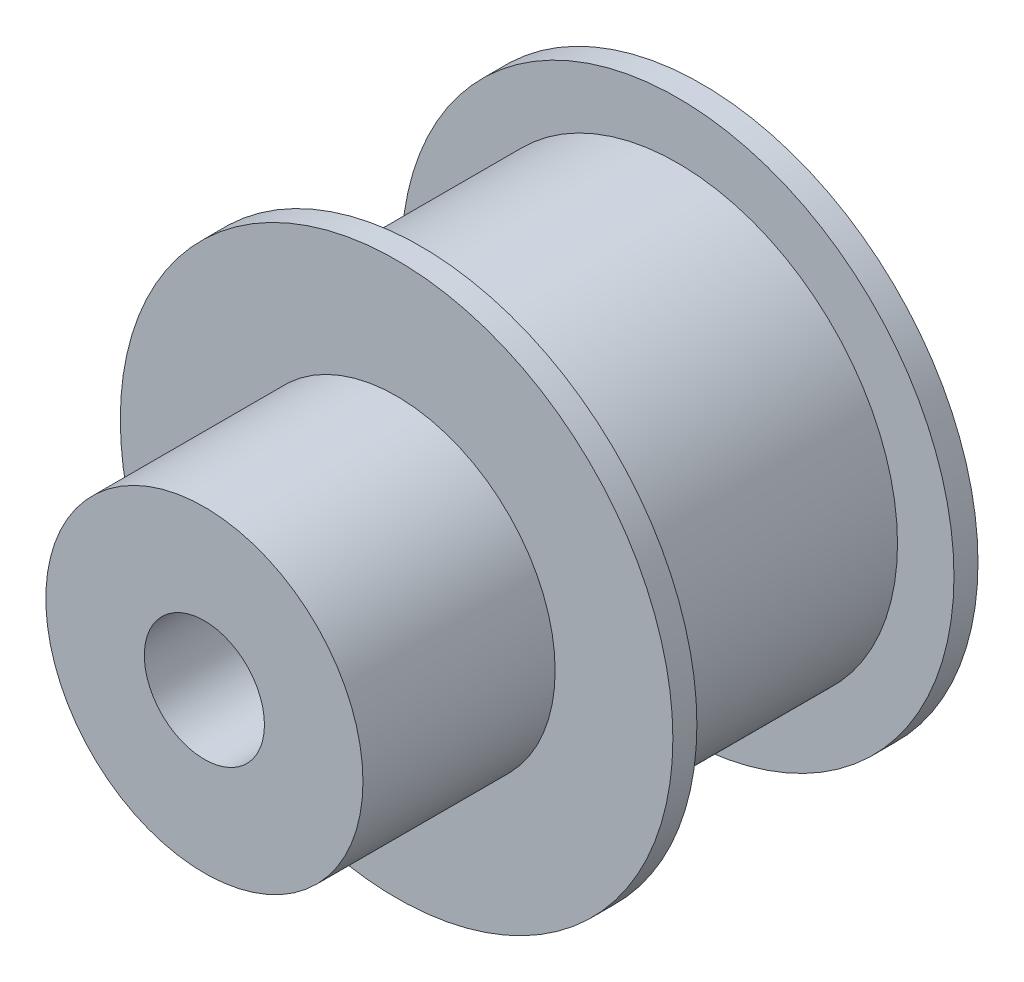
ISO-10303-21;
HEADER;
FILE_DESCRIPTION(('STEP AP214'),'2;1');
FILE_NAME('part.step','',(''),(''),'','','');
FILE_SCHEMA(('AUTOMOTIVE_DESIGN { 1 0 10303 214 1 1 1 1 }'));
ENDSEC;
DATA;
#1=APPLICATION_CONTEXT('core data for automotive mechanical design processes');
#2=APPLICATION_PROTOCOL_DEFINITION('international standard','automotive_design',2000,#1);
#3=PRODUCT_CONTEXT('',#1,'mechanical');
#4=PRODUCT('Part','Part','',(#3));
#5=PRODUCT_RELATED_PRODUCT_CATEGORY('part','',(#4));
#6=PRODUCT_DEFINITION_FORMATION('','',#4);
#7=PRODUCT_DEFINITION_CONTEXT('part definition',#1,'design');
#8=PRODUCT_DEFINITION('design','',#6,#7);
#9=PRODUCT_DEFINITION_SHAPE('','',#8);
#10=(LENGTH_UNIT() NAMED_UNIT(*) SI_UNIT(.MILLI.,.METRE.));
#11=(NAMED_UNIT(*) PLANE_ANGLE_UNIT() SI_UNIT($,.RADIAN.));
#12=(NAMED_UNIT(*) SI_UNIT($,.STERADIAN.) SOLID_ANGLE_UNIT());
#13=UNCERTAINTY_MEASURE_WITH_UNIT(LENGTH_MEASURE(1.E-05),#10,'distance_accuracy_value','');
#14=(GEOMETRIC_REPRESENTATION_CONTEXT(3) GLOBAL_UNCERTAINTY_ASSIGNED_CONTEXT((#13)) GLOBAL_UNIT_ASSIGNED_CONTEXT((#10,
#11,#12)) REPRESENTATION_CONTEXT('',''));
#15=CARTESIAN_POINT('',(0.,0.,0.));
#16=DIRECTION('',(0.,0.,1.));
#17=DIRECTION('',(1.,0.,0.));
#18=AXIS2_PLACEMENT_3D('',#15,#16,#17);
#19=CARTESIAN_POINT('',(0.,0.,12.7));
#20=DIRECTION('',(0.,0.,1.));
#21=DIRECTION('',(1.,0.,0.));
#22=AXIS2_PLACEMENT_3D('',#19,#20,#21);
#23=PLANE('',#22);
#24=CARTESIAN_POINT('',(0.,0.,12.7));
#25=DIRECTION('',(0.,0.,1.));
#26=DIRECTION('',(1.,0.,0.));
#27=AXIS2_PLACEMENT_3D('',#24,#25,#26);
#28=CIRCLE('',#27,11.5);
#29=CARTESIAN_POINT('',(11.5,0.,12.7));
#30=VERTEX_POINT('',#29);
#31=EDGE_CURVE('E48',#30,#30,#28,.T.);
#32=ORIENTED_EDGE('',*,*,#31,.T.);
#33=EDGE_LOOP('',(#32));
#34=FACE_BOUND('',#33,.T.);
#35=CARTESIAN_POINT('',(0.,0.,12.7));
#36=DIRECTION('',(0.,0.,1.));
#37=DIRECTION('',(1.,0.,0.));
#38=AXIS2_PLACEMENT_3D('',#35,#36,#37);
#39=CIRCLE('',#38,6.6);
#40=CARTESIAN_POINT('',(6.6,0.,12.7));
#41=VERTEX_POINT('',#40);
#42=EDGE_CURVE('E57',#41,#41,#39,.T.);
#43=ORIENTED_EDGE('',*,*,#42,.F.);
#44=EDGE_LOOP('',(#43));
#45=FACE_BOUND('',#44,.T.);
#46=ADVANCED_FACE('F32',(#34,#45),#23,.T.);
#47=CARTESIAN_POINT('',(0.,0.,1.));
#48=DIRECTION('',(0.,0.,1.));
#49=DIRECTION('',(1.,0.,0.));
#50=AXIS2_PLACEMENT_3D('',#47,#48,#49);
#51=PLANE('',#50);
#52=CARTESIAN_POINT('',(0.,0.,1.));
#53=DIRECTION('',(0.,0.,1.));
#54=DIRECTION('',(1.,0.,0.));
#55=AXIS2_PLACEMENT_3D('',#52,#53,#54);
#56=CIRCLE('',#55,11.5);
#57=CARTESIAN_POINT('',(11.5,0.,1.));
#58=VERTEX_POINT('',#57);
#59=EDGE_CURVE('E10',#58,#58,#56,.T.);
#60=ORIENTED_EDGE('',*,*,#59,.T.);
#61=EDGE_LOOP('',(#60));
#62=FACE_BOUND('',#61,.T.);
#63=CARTESIAN_POINT('',(0.,0.,1.));
#64=DIRECTION('',(0.,0.,1.));
#65=DIRECTION('',(1.,0.,0.));
#66=AXIS2_PLACEMENT_3D('',#63,#64,#65);
#67=CIRCLE('',#66,9.15);
#68=CARTESIAN_POINT('',(9.15,0.,1.));
#69=VERTEX_POINT('',#68);
#70=EDGE_CURVE('E45',#69,#69,#67,.T.);
#71=ORIENTED_EDGE('',*,*,#70,.F.);
#72=EDGE_LOOP('',(#71));
#73=FACE_BOUND('',#72,.T.);
#74=ADVANCED_FACE('F92',(#62,#73),#51,.T.);
#75=CARTESIAN_POINT('',(0.,0.,1.));
#76=DIRECTION('',(0.,0.,-1.));
#77=DIRECTION('',(-1.,0.,0.));
#78=AXIS2_PLACEMENT_3D('',#75,#76,#77);
#79=CYLINDRICAL_SURFACE('',#78,11.5);
#80=ORIENTED_EDGE('',*,*,#59,.F.);
#81=EDGE_LOOP('',(#80));
#82=FACE_BOUND('',#81,.T.);
#83=CARTESIAN_POINT('',(0.,0.,0.));
#84=DIRECTION('',(0.,0.,1.));
#85=DIRECTION('',(1.,0.,0.));
#86=AXIS2_PLACEMENT_3D('',#83,#84,#85);
#87=CIRCLE('',#86,11.5);
#88=CARTESIAN_POINT('',(11.5,0.,0.));
#89=VERTEX_POINT('',#88);
#90=EDGE_CURVE('E36',#89,#89,#87,.T.);
#91=ORIENTED_EDGE('',*,*,#90,.T.);
#92=EDGE_LOOP('',(#91));
#93=FACE_BOUND('',#92,.T.);
#94=ADVANCED_FACE('F34',(#82,#93),#79,.T.);
#95=CARTESIAN_POINT('',(0.,0.,0.));
#96=DIRECTION('',(0.,0.,1.));
#97=DIRECTION('',(1.,0.,0.));
#98=AXIS2_PLACEMENT_3D('',#95,#96,#97);
#99=PLANE('',#98);
#100=CARTESIAN_POINT('',(0.,0.,0.));
#101=DIRECTION('',(0.,0.,1.));
#102=DIRECTION('',(1.,0.,0.));
#103=AXIS2_PLACEMENT_3D('',#100,#101,#102);
#104=CIRCLE('',#103,2.5);
#105=CARTESIAN_POINT('',(2.5,0.,0.));
#106=VERTEX_POINT('',#105);
#107=EDGE_CURVE('E60',#106,#106,#104,.T.);
#108=ORIENTED_EDGE('',*,*,#107,.T.);
#109=EDGE_LOOP('',(#108));
#110=FACE_BOUND('',#109,.T.);
#111=ORIENTED_EDGE('',*,*,#90,.F.);
#112=EDGE_LOOP('',(#111));
#113=FACE_BOUND('',#112,.T.);
#114=ADVANCED_FACE('F69',(#110,#113),#99,.F.);
#115=CARTESIAN_POINT('',(0.,0.,11.7));
#116=DIRECTION('',(0.,0.,-1.));
#117=DIRECTION('',(-1.,0.,0.));
#118=AXIS2_PLACEMENT_3D('',#115,#116,#117);
#119=CYLINDRICAL_SURFACE('',#118,9.15);
#120=CARTESIAN_POINT('',(0.,0.,11.7));
#121=DIRECTION('',(0.,0.,1.));
#122=DIRECTION('',(1.,0.,0.));
#123=AXIS2_PLACEMENT_3D('',#120,#121,#122);
#124=CIRCLE('',#123,9.15);
#125=CARTESIAN_POINT('',(9.15,0.,11.7));
#126=VERTEX_POINT('',#125);
#127=EDGE_CURVE('E43',#126,#126,#124,.T.);
#128=ORIENTED_EDGE('',*,*,#127,.F.);
#129=EDGE_LOOP('',(#128));
#130=FACE_BOUND('',#129,.T.);
#131=ORIENTED_EDGE('',*,*,#70,.T.);
#132=EDGE_LOOP('',(#131));
#133=FACE_BOUND('',#132,.T.);
#134=ADVANCED_FACE('F103',(#130,#133),#119,.T.);
#135=CARTESIAN_POINT('',(0.,0.,11.7));
#136=DIRECTION('',(0.,0.,1.));
#137=DIRECTION('',(1.,0.,0.));
#138=AXIS2_PLACEMENT_3D('',#135,#136,#137);
#139=PLANE('',#138);
#140=CARTESIAN_POINT('',(0.,0.,11.7));
#141=DIRECTION('',(0.,0.,1.));
#142=DIRECTION('',(1.,0.,0.));
#143=AXIS2_PLACEMENT_3D('',#140,#141,#142);
#144=CIRCLE('',#143,11.5);
#145=CARTESIAN_POINT('',(11.5,0.,11.7));
#146=VERTEX_POINT('',#145);
#147=EDGE_CURVE('E51',#146,#146,#144,.T.);
#148=ORIENTED_EDGE('',*,*,#147,.F.);
#149=EDGE_LOOP('',(#148));
#150=FACE_BOUND('',#149,.T.);
#151=ORIENTED_EDGE('',*,*,#127,.T.);
#152=EDGE_LOOP('',(#151));
#153=FACE_BOUND('',#152,.T.);
#154=ADVANCED_FACE('F100',(#150,#153),#139,.F.);
#155=CARTESIAN_POINT('',(0.,0.,12.7));
#156=DIRECTION('',(0.,0.,-1.));
#157=DIRECTION('',(-1.,0.,0.));
#158=AXIS2_PLACEMENT_3D('',#155,#156,#157);
#159=CYLINDRICAL_SURFACE('',#158,11.5);
#160=ORIENTED_EDGE('',*,*,#31,.F.);
#161=EDGE_LOOP('',(#160));
#162=FACE_BOUND('',#161,.T.);
#163=ORIENTED_EDGE('',*,*,#147,.T.);
#164=EDGE_LOOP('',(#163));
#165=FACE_BOUND('',#164,.T.);
#166=ADVANCED_FACE('F87',(#162,#165),#159,.T.);
#167=CARTESIAN_POINT('',(0.,0.,20.7));
#168=DIRECTION('',(0.,0.,-1.));
#169=DIRECTION('',(-1.,0.,0.));
#170=AXIS2_PLACEMENT_3D('',#167,#168,#169);
#171=CYLINDRICAL_SURFACE('',#170,6.6);
#172=CARTESIAN_POINT('',(0.,0.,20.7));
#173=DIRECTION('',(0.,0.,1.));
#174=DIRECTION('',(1.,0.,0.));
#175=AXIS2_PLACEMENT_3D('',#172,#173,#174);
#176=CIRCLE('',#175,6.6);
#177=CARTESIAN_POINT('',(6.6,0.,20.7));
#178=VERTEX_POINT('',#177);
#179=EDGE_CURVE('E54',#178,#178,#176,.T.);
#180=ORIENTED_EDGE('',*,*,#179,.F.);
#181=EDGE_LOOP('',(#180));
#182=FACE_BOUND('',#181,.T.);
#183=ORIENTED_EDGE('',*,*,#42,.T.);
#184=EDGE_LOOP('',(#183));
#185=FACE_BOUND('',#184,.T.);
#186=ADVANCED_FACE('F81',(#182,#185),#171,.T.);
#187=CARTESIAN_POINT('',(0.,0.,20.7));
#188=DIRECTION('',(0.,0.,1.));
#189=DIRECTION('',(1.,0.,0.));
#190=AXIS2_PLACEMENT_3D('',#187,#188,#189);
#191=PLANE('',#190);
#192=CARTESIAN_POINT('',(0.,0.,20.7));
#193=DIRECTION('',(0.,0.,1.));
#194=DIRECTION('',(1.,0.,0.));
#195=AXIS2_PLACEMENT_3D('',#192,#193,#194);
#196=CIRCLE('',#195,2.5);
#197=CARTESIAN_POINT('',(2.5,0.,20.7));
#198=VERTEX_POINT('',#197);
#199=EDGE_CURVE('E63',#198,#198,#196,.T.);
#200=ORIENTED_EDGE('',*,*,#199,.F.);
#201=EDGE_LOOP('',(#200));
#202=FACE_BOUND('',#201,.T.);
#203=ORIENTED_EDGE('',*,*,#179,.T.);
#204=EDGE_LOOP('',(#203));
#205=FACE_BOUND('',#204,.T.);
#206=ADVANCED_FACE('F75',(#202,#205),#191,.T.);
#207=CARTESIAN_POINT('',(0.,0.,0.));
#208=DIRECTION('',(0.,0.,1.));
#209=DIRECTION('',(1.,0.,0.));
#210=AXIS2_PLACEMENT_3D('',#207,#208,#209);
#211=CYLINDRICAL_SURFACE('',#210,2.5);
#212=ORIENTED_EDGE('',*,*,#107,.F.);
#213=EDGE_LOOP('',(#212));
#214=FACE_BOUND('',#213,.T.);
#215=ORIENTED_EDGE('',*,*,#199,.T.);
#216=EDGE_LOOP('',(#215));
#217=FACE_BOUND('',#216,.T.);
#218=ADVANCED_FACE('F72',(#214,#217),#211,.F.);
#219=CLOSED_SHELL('',(#46,#74,#94,#114,#134,#154,#166,#186,#206,#218));
#220=MANIFOLD_SOLID_BREP('B2',#219);
#221=ADVANCED_BREP_SHAPE_REPRESENTATION('',(#18,#220),#14);
#222=SHAPE_DEFINITION_REPRESENTATION(#9,#221);
ENDSEC;
END-ISO-10303-21;
